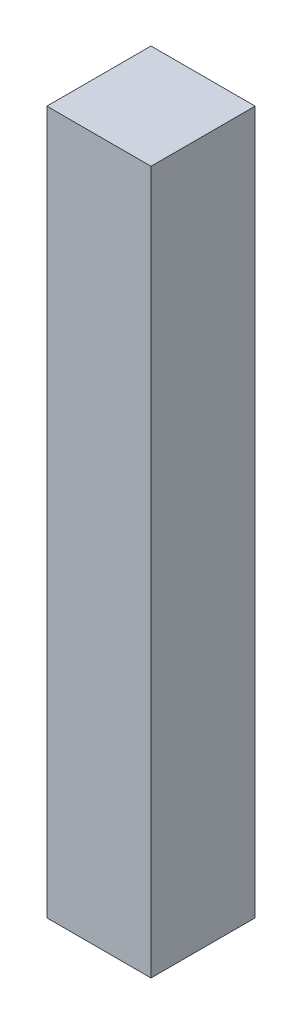
ISO-10303-21;
HEADER;
FILE_DESCRIPTION(('STEP AP214'),'2;1');
FILE_NAME('part.step','',(''),(''),'','','');
FILE_SCHEMA(('AUTOMOTIVE_DESIGN { 1 0 10303 214 1 1 1 1 }'));
ENDSEC;
DATA;
#1=APPLICATION_CONTEXT('core data for automotive mechanical design processes');
#2=APPLICATION_PROTOCOL_DEFINITION('international standard','automotive_design',2000,#1);
#3=PRODUCT_CONTEXT('',#1,'mechanical');
#4=PRODUCT('Part','Part','',(#3));
#5=PRODUCT_RELATED_PRODUCT_CATEGORY('part','',(#4));
#6=PRODUCT_DEFINITION_FORMATION('','',#4);
#7=PRODUCT_DEFINITION_CONTEXT('part definition',#1,'design');
#8=PRODUCT_DEFINITION('design','',#6,#7);
#9=PRODUCT_DEFINITION_SHAPE('','',#8);
#10=(LENGTH_UNIT() NAMED_UNIT(*) SI_UNIT(.MILLI.,.METRE.));
#11=(NAMED_UNIT(*) PLANE_ANGLE_UNIT() SI_UNIT($,.RADIAN.));
#12=(NAMED_UNIT(*) SI_UNIT($,.STERADIAN.) SOLID_ANGLE_UNIT());
#13=UNCERTAINTY_MEASURE_WITH_UNIT(LENGTH_MEASURE(1.E-05),#10,'distance_accuracy_value','');
#14=(GEOMETRIC_REPRESENTATION_CONTEXT(3) GLOBAL_UNCERTAINTY_ASSIGNED_CONTEXT((#13)) GLOBAL_UNIT_ASSIGNED_CONTEXT((#10,
#11,#12)) REPRESENTATION_CONTEXT('',''));
#15=CARTESIAN_POINT('',(0.,0.,0.));
#16=DIRECTION('',(0.,0.,1.));
#17=DIRECTION('',(1.,0.,0.));
#18=AXIS2_PLACEMENT_3D('',#15,#16,#17);
#19=CARTESIAN_POINT('',(0.,1.62597337004773,0.8));
#20=DIRECTION('',(1.,0.,0.));
#21=DIRECTION('',(0.,1.,0.));
#22=AXIS2_PLACEMENT_3D('',#19,#20,#21);
#23=PLANE('',#22);
#24=DIRECTION('',(0.,-1.,0.));
#25=VECTOR('',#24,1.);
#26=CARTESIAN_POINT('',(0.,1.62597337004773,0.));
#27=LINE('',#26,#25);
#28=CARTESIAN_POINT('',(0.,1.62597337004773,0.));
#29=VERTEX_POINT('',#28);
#30=CARTESIAN_POINT('',(0.,-3.77402662995227,0.));
#31=VERTEX_POINT('',#30);
#32=EDGE_CURVE('E107',#29,#31,#27,.T.);
#33=ORIENTED_EDGE('',*,*,#32,.T.);
#34=DIRECTION('',(0.,0.,-1.));
#35=VECTOR('',#34,1.);
#36=CARTESIAN_POINT('',(0.,-3.77402662995227,0.8));
#37=LINE('',#36,#35);
#38=CARTESIAN_POINT('',(0.,-3.77402662995227,0.8));
#39=VERTEX_POINT('',#38);
#40=EDGE_CURVE('E11',#39,#31,#37,.T.);
#41=ORIENTED_EDGE('',*,*,#40,.F.);
#42=DIRECTION('',(0.,-1.,0.));
#43=VECTOR('',#42,1.);
#44=CARTESIAN_POINT('',(0.,1.62597337004773,0.8));
#45=LINE('',#44,#43);
#46=CARTESIAN_POINT('',(0.,1.62597337004773,0.8));
#47=VERTEX_POINT('',#46);
#48=EDGE_CURVE('E91',#47,#39,#45,.T.);
#49=ORIENTED_EDGE('',*,*,#48,.F.);
#50=DIRECTION('',(0.,0.,-1.));
#51=VECTOR('',#50,1.);
#52=CARTESIAN_POINT('',(0.,1.62597337004773,0.8));
#53=LINE('',#52,#51);
#54=EDGE_CURVE('E103',#47,#29,#53,.T.);
#55=ORIENTED_EDGE('',*,*,#54,.T.);
#56=EDGE_LOOP('',(#33,#41,#49,#55));
#57=FACE_BOUND('',#56,.T.);
#58=ADVANCED_FACE('F39',(#57),#23,.F.);
#59=CARTESIAN_POINT('',(0.,-3.77402662995227,0.8));
#60=DIRECTION('',(0.,1.,0.));
#61=DIRECTION('',(0.,0.,1.));
#62=AXIS2_PLACEMENT_3D('',#59,#60,#61);
#63=PLANE('',#62);
#64=DIRECTION('',(1.,0.,0.));
#65=VECTOR('',#64,1.);
#66=CARTESIAN_POINT('',(0.,-3.77402662995227,0.));
#67=LINE('',#66,#65);
#68=CARTESIAN_POINT('',(0.800000000000001,-3.77402662995227,0.));
#69=VERTEX_POINT('',#68);
#70=EDGE_CURVE('E96',#31,#69,#67,.T.);
#71=ORIENTED_EDGE('',*,*,#70,.T.);
#72=DIRECTION('',(0.,0.,-1.));
#73=VECTOR('',#72,1.);
#74=CARTESIAN_POINT('',(0.800000000000001,-3.77402662995227,0.8));
#75=LINE('',#74,#73);
#76=CARTESIAN_POINT('',(0.800000000000001,-3.77402662995227,0.8));
#77=VERTEX_POINT('',#76);
#78=EDGE_CURVE('E48',#77,#69,#75,.T.);
#79=ORIENTED_EDGE('',*,*,#78,.F.);
#80=DIRECTION('',(1.,0.,0.));
#81=VECTOR('',#80,1.);
#82=CARTESIAN_POINT('',(0.,-3.77402662995227,0.8));
#83=LINE('',#82,#81);
#84=EDGE_CURVE('E86',#39,#77,#83,.T.);
#85=ORIENTED_EDGE('',*,*,#84,.F.);
#86=ORIENTED_EDGE('',*,*,#40,.T.);
#87=EDGE_LOOP('',(#71,#79,#85,#86));
#88=FACE_BOUND('',#87,.T.);
#89=ADVANCED_FACE('F95',(#88),#63,.F.);
#90=CARTESIAN_POINT('',(0.8,1.62597337004773,0.8));
#91=DIRECTION('',(-1.,0.,0.));
#92=DIRECTION('',(0.,-1.,0.));
#93=AXIS2_PLACEMENT_3D('',#90,#91,#92);
#94=PLANE('',#93);
#95=DIRECTION('',(0.,1.,0.));
#96=VECTOR('',#95,1.);
#97=CARTESIAN_POINT('',(0.8,1.62597337004773,0.));
#98=LINE('',#97,#96);
#99=CARTESIAN_POINT('',(0.8,1.62597337004773,0.));
#100=VERTEX_POINT('',#99);
#101=EDGE_CURVE('E73',#69,#100,#98,.T.);
#102=ORIENTED_EDGE('',*,*,#101,.T.);
#103=DIRECTION('',(0.,0.,-1.));
#104=VECTOR('',#103,1.);
#105=CARTESIAN_POINT('',(0.8,1.62597337004773,0.8));
#106=LINE('',#105,#104);
#107=CARTESIAN_POINT('',(0.8,1.62597337004773,0.8));
#108=VERTEX_POINT('',#107);
#109=EDGE_CURVE('E98',#108,#100,#106,.T.);
#110=ORIENTED_EDGE('',*,*,#109,.F.);
#111=DIRECTION('',(0.,1.,0.));
#112=VECTOR('',#111,1.);
#113=CARTESIAN_POINT('',(0.8,1.62597337004773,0.8));
#114=LINE('',#113,#112);
#115=EDGE_CURVE('E89',#77,#108,#114,.T.);
#116=ORIENTED_EDGE('',*,*,#115,.F.);
#117=ORIENTED_EDGE('',*,*,#78,.T.);
#118=EDGE_LOOP('',(#102,#110,#116,#117));
#119=FACE_BOUND('',#118,.T.);
#120=ADVANCED_FACE('F99',(#119),#94,.F.);
#121=CARTESIAN_POINT('',(0.,1.62597337004773,0.8));
#122=DIRECTION('',(0.,-1.,0.));
#123=DIRECTION('',(0.,0.,-1.));
#124=AXIS2_PLACEMENT_3D('',#121,#122,#123);
#125=PLANE('',#124);
#126=DIRECTION('',(-1.,0.,0.));
#127=VECTOR('',#126,1.);
#128=CARTESIAN_POINT('',(0.,1.62597337004773,0.));
#129=LINE('',#128,#127);
#130=EDGE_CURVE('E79',#100,#29,#129,.T.);
#131=ORIENTED_EDGE('',*,*,#130,.T.);
#132=ORIENTED_EDGE('',*,*,#54,.F.);
#133=DIRECTION('',(-1.,0.,0.));
#134=VECTOR('',#133,1.);
#135=CARTESIAN_POINT('',(0.,1.62597337004773,0.8));
#136=LINE('',#135,#134);
#137=EDGE_CURVE('E56',#108,#47,#136,.T.);
#138=ORIENTED_EDGE('',*,*,#137,.F.);
#139=ORIENTED_EDGE('',*,*,#109,.T.);
#140=EDGE_LOOP('',(#131,#132,#138,#139));
#141=FACE_BOUND('',#140,.T.);
#142=ADVANCED_FACE('F120',(#141),#125,.F.);
#143=CARTESIAN_POINT('',(0.,0.,0.8));
#144=DIRECTION('',(0.,0.,1.));
#145=DIRECTION('',(1.,0.,0.));
#146=AXIS2_PLACEMENT_3D('',#143,#144,#145);
#147=PLANE('',#146);
#148=ORIENTED_EDGE('',*,*,#48,.T.);
#149=ORIENTED_EDGE('',*,*,#84,.T.);
#150=ORIENTED_EDGE('',*,*,#115,.T.);
#151=ORIENTED_EDGE('',*,*,#137,.T.);
#152=EDGE_LOOP('',(#148,#149,#150,#151));
#153=FACE_BOUND('',#152,.T.);
#154=ADVANCED_FACE('F87',(#153),#147,.T.);
#155=CARTESIAN_POINT('',(0.,0.,0.));
#156=DIRECTION('',(0.,0.,1.));
#157=DIRECTION('',(1.,0.,0.));
#158=AXIS2_PLACEMENT_3D('',#155,#156,#157);
#159=PLANE('',#158);
#160=ORIENTED_EDGE('',*,*,#32,.F.);
#161=ORIENTED_EDGE('',*,*,#130,.F.);
#162=ORIENTED_EDGE('',*,*,#101,.F.);
#163=ORIENTED_EDGE('',*,*,#70,.F.);
#164=EDGE_LOOP('',(#160,#161,#162,#163));
#165=FACE_BOUND('',#164,.T.);
#166=ADVANCED_FACE('F123',(#165),#159,.F.);
#167=CLOSED_SHELL('',(#58,#89,#120,#142,#154,#166));
#168=MANIFOLD_SOLID_BREP('B2',#167);
#169=ADVANCED_BREP_SHAPE_REPRESENTATION('',(#18,#168),#14);
#170=SHAPE_DEFINITION_REPRESENTATION(#9,#169);
ENDSEC;
END-ISO-10303-21;
